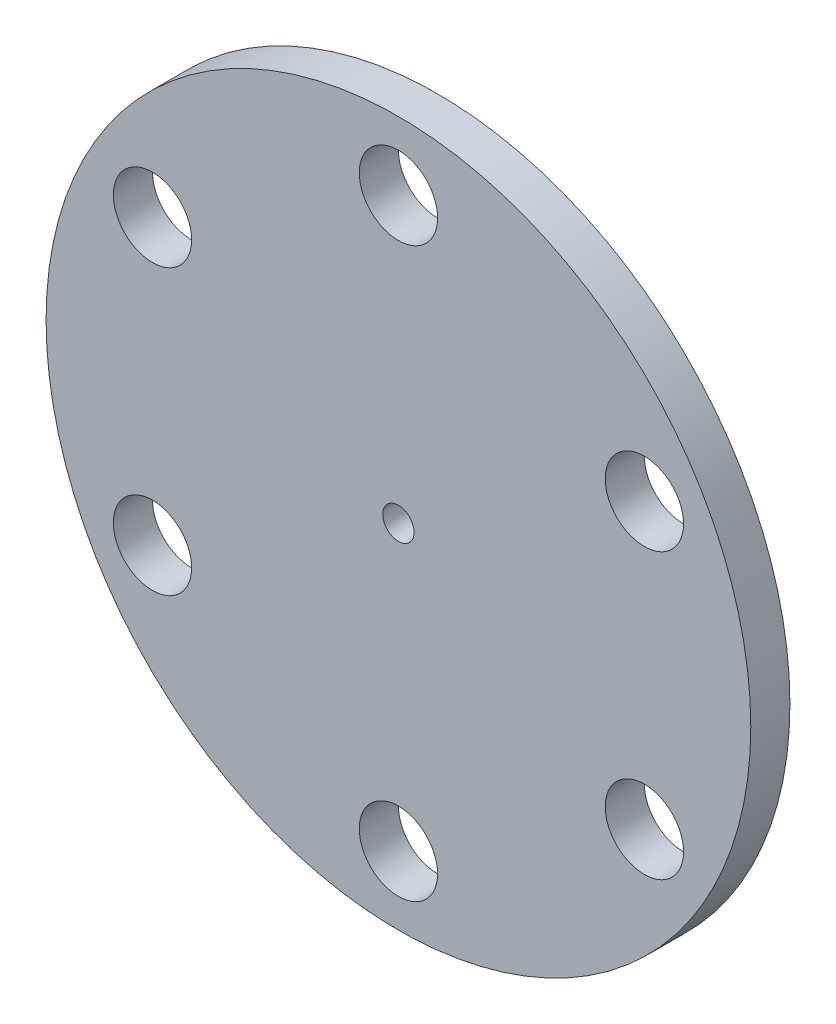
ISO-10303-21;
HEADER;
FILE_DESCRIPTION(('STEP AP214'),'2;1');
FILE_NAME('part.step','',(''),(''),'','','');
FILE_SCHEMA(('AUTOMOTIVE_DESIGN { 1 0 10303 214 1 1 1 1 }'));
ENDSEC;
DATA;
#1=APPLICATION_CONTEXT('core data for automotive mechanical design processes');
#2=APPLICATION_PROTOCOL_DEFINITION('international standard','automotive_design',2000,#1);
#3=PRODUCT_CONTEXT('',#1,'mechanical');
#4=PRODUCT('Part','Part','',(#3));
#5=PRODUCT_RELATED_PRODUCT_CATEGORY('part','',(#4));
#6=PRODUCT_DEFINITION_FORMATION('','',#4);
#7=PRODUCT_DEFINITION_CONTEXT('part definition',#1,'design');
#8=PRODUCT_DEFINITION('design','',#6,#7);
#9=PRODUCT_DEFINITION_SHAPE('','',#8);
#10=(LENGTH_UNIT() NAMED_UNIT(*) SI_UNIT(.MILLI.,.METRE.));
#11=(NAMED_UNIT(*) PLANE_ANGLE_UNIT() SI_UNIT($,.RADIAN.));
#12=(NAMED_UNIT(*) SI_UNIT($,.STERADIAN.) SOLID_ANGLE_UNIT());
#13=UNCERTAINTY_MEASURE_WITH_UNIT(LENGTH_MEASURE(1.E-05),#10,'distance_accuracy_value','');
#14=(GEOMETRIC_REPRESENTATION_CONTEXT(3) GLOBAL_UNCERTAINTY_ASSIGNED_CONTEXT((#13)) GLOBAL_UNIT_ASSIGNED_CONTEXT((#10,
#11,#12)) REPRESENTATION_CONTEXT('',''));
#15=CARTESIAN_POINT('',(0.,0.,0.));
#16=DIRECTION('',(0.,0.,1.));
#17=DIRECTION('',(1.,0.,0.));
#18=AXIS2_PLACEMENT_3D('',#15,#16,#17);
#19=CARTESIAN_POINT('',(0.,0.,5.));
#20=DIRECTION('',(0.,0.,1.));
#21=DIRECTION('',(1.,0.,0.));
#22=AXIS2_PLACEMENT_3D('',#19,#20,#21);
#23=PLANE('',#22);
#24=CARTESIAN_POINT('',(-31.4104291677928,-18.1348197353913,5.));
#25=DIRECTION('',(0.,0.,1.));
#26=DIRECTION('',(1.,0.,0.));
#27=AXIS2_PLACEMENT_3D('',#24,#25,#26);
#28=CIRCLE('',#27,5.);
#29=CARTESIAN_POINT('',(-26.4104291677928,-18.1348197353913,5.));
#30=VERTEX_POINT('',#29);
#31=EDGE_CURVE('E73',#30,#30,#28,.T.);
#32=ORIENTED_EDGE('',*,*,#31,.F.);
#33=EDGE_LOOP('',(#32));
#34=FACE_BOUND('',#33,.T.);
#35=CARTESIAN_POINT('',(31.4104291678006,-18.1348197353869,5.));
#36=DIRECTION('',(0.,0.,1.));
#37=DIRECTION('',(1.,0.,0.));
#38=AXIS2_PLACEMENT_3D('',#35,#36,#37);
#39=CIRCLE('',#38,5.);
#40=CARTESIAN_POINT('',(36.4104291678006,-18.1348197353869,5.));
#41=VERTEX_POINT('',#40);
#42=EDGE_CURVE('E61',#41,#41,#39,.T.);
#43=ORIENTED_EDGE('',*,*,#42,.F.);
#44=EDGE_LOOP('',(#43));
#45=FACE_BOUND('',#44,.T.);
#46=CARTESIAN_POINT('',(0.,0.,5.));
#47=DIRECTION('',(0.,0.,1.));
#48=DIRECTION('',(1.,0.,0.));
#49=AXIS2_PLACEMENT_3D('',#46,#47,#48);
#50=CIRCLE('',#49,2.);
#51=CARTESIAN_POINT('',(2.,0.,5.));
#52=VERTEX_POINT('',#51);
#53=EDGE_CURVE('E49',#52,#52,#50,.T.);
#54=ORIENTED_EDGE('',*,*,#53,.F.);
#55=EDGE_LOOP('',(#54));
#56=FACE_BOUND('',#55,.T.);
#57=CARTESIAN_POINT('',(0.,0.,5.));
#58=DIRECTION('',(0.,0.,1.));
#59=DIRECTION('',(1.,0.,0.));
#60=AXIS2_PLACEMENT_3D('',#57,#58,#59);
#61=CIRCLE('',#60,45.);
#62=CARTESIAN_POINT('',(45.,0.,5.));
#63=VERTEX_POINT('',#62);
#64=EDGE_CURVE('E10',#63,#63,#61,.T.);
#65=ORIENTED_EDGE('',*,*,#64,.T.);
#66=EDGE_LOOP('',(#65));
#67=FACE_BOUND('',#66,.T.);
#68=CARTESIAN_POINT('',(0.,36.2696394707782,5.));
#69=DIRECTION('',(0.,0.,1.));
#70=DIRECTION('',(1.,0.,0.));
#71=AXIS2_PLACEMENT_3D('',#68,#69,#70);
#72=CIRCLE('',#71,5.);
#73=CARTESIAN_POINT('',(5.,36.2696394707782,5.));
#74=VERTEX_POINT('',#73);
#75=EDGE_CURVE('E44',#74,#74,#72,.T.);
#76=ORIENTED_EDGE('',*,*,#75,.F.);
#77=EDGE_LOOP('',(#76));
#78=FACE_BOUND('',#77,.T.);
#79=CARTESIAN_POINT('',(31.410429167798,18.1348197353913,5.));
#80=DIRECTION('',(0.,0.,1.));
#81=DIRECTION('',(1.,0.,0.));
#82=AXIS2_PLACEMENT_3D('',#79,#80,#81);
#83=CIRCLE('',#82,5.);
#84=CARTESIAN_POINT('',(36.410429167798,18.1348197353913,5.));
#85=VERTEX_POINT('',#84);
#86=EDGE_CURVE('E55',#85,#85,#83,.T.);
#87=ORIENTED_EDGE('',*,*,#86,.F.);
#88=EDGE_LOOP('',(#87));
#89=FACE_BOUND('',#88,.T.);
#90=CARTESIAN_POINT('',(5.14534227134303E-12,-36.2696394707782,5.));
#91=DIRECTION('',(0.,0.,1.));
#92=DIRECTION('',(1.,0.,0.));
#93=AXIS2_PLACEMENT_3D('',#90,#91,#92);
#94=CIRCLE('',#93,5.);
#95=CARTESIAN_POINT('',(5.00000000000515,-36.2696394707782,5.));
#96=VERTEX_POINT('',#95);
#97=EDGE_CURVE('E67',#96,#96,#94,.T.);
#98=ORIENTED_EDGE('',*,*,#97,.F.);
#99=EDGE_LOOP('',(#98));
#100=FACE_BOUND('',#99,.T.);
#101=CARTESIAN_POINT('',(-31.4104291677954,18.1348197353868,5.));
#102=DIRECTION('',(0.,0.,1.));
#103=DIRECTION('',(1.,0.,0.));
#104=AXIS2_PLACEMENT_3D('',#101,#102,#103);
#105=CIRCLE('',#104,5.);
#106=CARTESIAN_POINT('',(-26.4104291677954,18.1348197353868,5.));
#107=VERTEX_POINT('',#106);
#108=EDGE_CURVE('E79',#107,#107,#105,.T.);
#109=ORIENTED_EDGE('',*,*,#108,.F.);
#110=EDGE_LOOP('',(#109));
#111=FACE_BOUND('',#110,.T.);
#112=ADVANCED_FACE('F33',(#34,#45,#56,#67,#78,#89,#100,#111),#23,.T.);
#113=CARTESIAN_POINT('',(0.,0.,0.));
#114=DIRECTION('',(0.,0.,1.));
#115=DIRECTION('',(1.,0.,0.));
#116=AXIS2_PLACEMENT_3D('',#113,#114,#115);
#117=PLANE('',#116);
#118=CARTESIAN_POINT('',(0.,0.,0.));
#119=DIRECTION('',(0.,0.,1.));
#120=DIRECTION('',(1.,0.,0.));
#121=AXIS2_PLACEMENT_3D('',#118,#119,#120);
#122=CIRCLE('',#121,45.);
#123=CARTESIAN_POINT('',(45.,0.,0.));
#124=VERTEX_POINT('',#123);
#125=EDGE_CURVE('E37',#124,#124,#122,.T.);
#126=ORIENTED_EDGE('',*,*,#125,.F.);
#127=EDGE_LOOP('',(#126));
#128=FACE_BOUND('',#127,.T.);
#129=CARTESIAN_POINT('',(0.,36.2696394707782,0.));
#130=DIRECTION('',(0.,0.,1.));
#131=DIRECTION('',(1.,0.,0.));
#132=AXIS2_PLACEMENT_3D('',#129,#130,#131);
#133=CIRCLE('',#132,5.);
#134=CARTESIAN_POINT('',(5.,36.2696394707782,0.));
#135=VERTEX_POINT('',#134);
#136=EDGE_CURVE('E46',#135,#135,#133,.T.);
#137=ORIENTED_EDGE('',*,*,#136,.T.);
#138=EDGE_LOOP('',(#137));
#139=FACE_BOUND('',#138,.T.);
#140=CARTESIAN_POINT('',(0.,0.,0.));
#141=DIRECTION('',(0.,0.,1.));
#142=DIRECTION('',(1.,0.,0.));
#143=AXIS2_PLACEMENT_3D('',#140,#141,#142);
#144=CIRCLE('',#143,2.);
#145=CARTESIAN_POINT('',(2.,0.,0.));
#146=VERTEX_POINT('',#145);
#147=EDGE_CURVE('E52',#146,#146,#144,.T.);
#148=ORIENTED_EDGE('',*,*,#147,.T.);
#149=EDGE_LOOP('',(#148));
#150=FACE_BOUND('',#149,.T.);
#151=CARTESIAN_POINT('',(31.410429167798,18.1348197353913,0.));
#152=DIRECTION('',(0.,0.,1.));
#153=DIRECTION('',(1.,0.,0.));
#154=AXIS2_PLACEMENT_3D('',#151,#152,#153);
#155=CIRCLE('',#154,5.);
#156=CARTESIAN_POINT('',(36.410429167798,18.1348197353913,0.));
#157=VERTEX_POINT('',#156);
#158=EDGE_CURVE('E58',#157,#157,#155,.T.);
#159=ORIENTED_EDGE('',*,*,#158,.T.);
#160=EDGE_LOOP('',(#159));
#161=FACE_BOUND('',#160,.T.);
#162=CARTESIAN_POINT('',(31.4104291678006,-18.1348197353869,0.));
#163=DIRECTION('',(0.,0.,1.));
#164=DIRECTION('',(1.,0.,0.));
#165=AXIS2_PLACEMENT_3D('',#162,#163,#164);
#166=CIRCLE('',#165,5.);
#167=CARTESIAN_POINT('',(36.4104291678006,-18.1348197353869,0.));
#168=VERTEX_POINT('',#167);
#169=EDGE_CURVE('E64',#168,#168,#166,.T.);
#170=ORIENTED_EDGE('',*,*,#169,.T.);
#171=EDGE_LOOP('',(#170));
#172=FACE_BOUND('',#171,.T.);
#173=CARTESIAN_POINT('',(5.14534227134303E-12,-36.2696394707782,0.));
#174=DIRECTION('',(0.,0.,1.));
#175=DIRECTION('',(1.,0.,0.));
#176=AXIS2_PLACEMENT_3D('',#173,#174,#175);
#177=CIRCLE('',#176,5.);
#178=CARTESIAN_POINT('',(5.00000000000515,-36.2696394707782,0.));
#179=VERTEX_POINT('',#178);
#180=EDGE_CURVE('E70',#179,#179,#177,.T.);
#181=ORIENTED_EDGE('',*,*,#180,.T.);
#182=EDGE_LOOP('',(#181));
#183=FACE_BOUND('',#182,.T.);
#184=CARTESIAN_POINT('',(-31.4104291677928,-18.1348197353913,0.));
#185=DIRECTION('',(0.,0.,1.));
#186=DIRECTION('',(1.,0.,0.));
#187=AXIS2_PLACEMENT_3D('',#184,#185,#186);
#188=CIRCLE('',#187,5.);
#189=CARTESIAN_POINT('',(-26.4104291677928,-18.1348197353913,0.));
#190=VERTEX_POINT('',#189);
#191=EDGE_CURVE('E76',#190,#190,#188,.T.);
#192=ORIENTED_EDGE('',*,*,#191,.T.);
#193=EDGE_LOOP('',(#192));
#194=FACE_BOUND('',#193,.T.);
#195=CARTESIAN_POINT('',(-31.4104291677954,18.1348197353868,0.));
#196=DIRECTION('',(0.,0.,1.));
#197=DIRECTION('',(1.,0.,0.));
#198=AXIS2_PLACEMENT_3D('',#195,#196,#197);
#199=CIRCLE('',#198,5.);
#200=CARTESIAN_POINT('',(-26.4104291677954,18.1348197353868,0.));
#201=VERTEX_POINT('',#200);
#202=EDGE_CURVE('E82',#201,#201,#199,.T.);
#203=ORIENTED_EDGE('',*,*,#202,.T.);
#204=EDGE_LOOP('',(#203));
#205=FACE_BOUND('',#204,.T.);
#206=ADVANCED_FACE('F92',(#128,#139,#150,#161,#172,#183,#194,#205),#117,.F.);
#207=CARTESIAN_POINT('',(0.,0.,5.));
#208=DIRECTION('',(0.,0.,-1.));
#209=DIRECTION('',(-1.,0.,0.));
#210=AXIS2_PLACEMENT_3D('',#207,#208,#209);
#211=CYLINDRICAL_SURFACE('',#210,45.);
#212=ORIENTED_EDGE('',*,*,#64,.F.);
#213=EDGE_LOOP('',(#212));
#214=FACE_BOUND('',#213,.T.);
#215=ORIENTED_EDGE('',*,*,#125,.T.);
#216=EDGE_LOOP('',(#215));
#217=FACE_BOUND('',#216,.T.);
#218=ADVANCED_FACE('F35',(#214,#217),#211,.T.);
#219=CARTESIAN_POINT('',(0.,36.2696394707782,5.));
#220=DIRECTION('',(0.,0.,-1.));
#221=DIRECTION('',(-1.,0.,0.));
#222=AXIS2_PLACEMENT_3D('',#219,#220,#221);
#223=CYLINDRICAL_SURFACE('',#222,5.);
#224=ORIENTED_EDGE('',*,*,#75,.T.);
#225=EDGE_LOOP('',(#224));
#226=FACE_BOUND('',#225,.T.);
#227=ORIENTED_EDGE('',*,*,#136,.F.);
#228=EDGE_LOOP('',(#227));
#229=FACE_BOUND('',#228,.T.);
#230=ADVANCED_FACE('F102',(#226,#229),#223,.F.);
#231=CARTESIAN_POINT('',(0.,0.,5.));
#232=DIRECTION('',(0.,0.,-1.));
#233=DIRECTION('',(-1.,0.,0.));
#234=AXIS2_PLACEMENT_3D('',#231,#232,#233);
#235=CYLINDRICAL_SURFACE('',#234,2.);
#236=ORIENTED_EDGE('',*,*,#53,.T.);
#237=EDGE_LOOP('',(#236));
#238=FACE_BOUND('',#237,.T.);
#239=ORIENTED_EDGE('',*,*,#147,.F.);
#240=EDGE_LOOP('',(#239));
#241=FACE_BOUND('',#240,.T.);
#242=ADVANCED_FACE('F105',(#238,#241),#235,.F.);
#243=CARTESIAN_POINT('',(31.410429167798,18.1348197353913,5.));
#244=DIRECTION('',(0.,0.,-1.));
#245=DIRECTION('',(-1.,0.,0.));
#246=AXIS2_PLACEMENT_3D('',#243,#244,#245);
#247=CYLINDRICAL_SURFACE('',#246,5.);
#248=ORIENTED_EDGE('',*,*,#86,.T.);
#249=EDGE_LOOP('',(#248));
#250=FACE_BOUND('',#249,.T.);
#251=ORIENTED_EDGE('',*,*,#158,.F.);
#252=EDGE_LOOP('',(#251));
#253=FACE_BOUND('',#252,.T.);
#254=ADVANCED_FACE('F109',(#250,#253),#247,.F.);
#255=CARTESIAN_POINT('',(31.4104291678006,-18.1348197353869,5.));
#256=DIRECTION('',(0.,0.,-1.));
#257=DIRECTION('',(-1.,0.,0.));
#258=AXIS2_PLACEMENT_3D('',#255,#256,#257);
#259=CYLINDRICAL_SURFACE('',#258,5.);
#260=ORIENTED_EDGE('',*,*,#42,.T.);
#261=EDGE_LOOP('',(#260));
#262=FACE_BOUND('',#261,.T.);
#263=ORIENTED_EDGE('',*,*,#169,.F.);
#264=EDGE_LOOP('',(#263));
#265=FACE_BOUND('',#264,.T.);
#266=ADVANCED_FACE('F113',(#262,#265),#259,.F.);
#267=CARTESIAN_POINT('',(5.14534227134303E-12,-36.2696394707782,5.));
#268=DIRECTION('',(0.,0.,-1.));
#269=DIRECTION('',(-1.,0.,0.));
#270=AXIS2_PLACEMENT_3D('',#267,#268,#269);
#271=CYLINDRICAL_SURFACE('',#270,5.);
#272=ORIENTED_EDGE('',*,*,#97,.T.);
#273=EDGE_LOOP('',(#272));
#274=FACE_BOUND('',#273,.T.);
#275=ORIENTED_EDGE('',*,*,#180,.F.);
#276=EDGE_LOOP('',(#275));
#277=FACE_BOUND('',#276,.T.);
#278=ADVANCED_FACE('F117',(#274,#277),#271,.F.);
#279=CARTESIAN_POINT('',(-31.4104291677928,-18.1348197353913,5.));
#280=DIRECTION('',(0.,0.,-1.));
#281=DIRECTION('',(-1.,0.,0.));
#282=AXIS2_PLACEMENT_3D('',#279,#280,#281);
#283=CYLINDRICAL_SURFACE('',#282,5.);
#284=ORIENTED_EDGE('',*,*,#31,.T.);
#285=EDGE_LOOP('',(#284));
#286=FACE_BOUND('',#285,.T.);
#287=ORIENTED_EDGE('',*,*,#191,.F.);
#288=EDGE_LOOP('',(#287));
#289=FACE_BOUND('',#288,.T.);
#290=ADVANCED_FACE('F121',(#286,#289),#283,.F.);
#291=CARTESIAN_POINT('',(-31.4104291677954,18.1348197353868,5.));
#292=DIRECTION('',(0.,0.,-1.));
#293=DIRECTION('',(-1.,0.,0.));
#294=AXIS2_PLACEMENT_3D('',#291,#292,#293);
#295=CYLINDRICAL_SURFACE('',#294,5.);
#296=ORIENTED_EDGE('',*,*,#108,.T.);
#297=EDGE_LOOP('',(#296));
#298=FACE_BOUND('',#297,.T.);
#299=ORIENTED_EDGE('',*,*,#202,.F.);
#300=EDGE_LOOP('',(#299));
#301=FACE_BOUND('',#300,.T.);
#302=ADVANCED_FACE('F88',(#298,#301),#295,.F.);
#303=CLOSED_SHELL('',(#112,#206,#218,#230,#242,#254,#266,#278,#290,#302));
#304=MANIFOLD_SOLID_BREP('B2',#303);
#305=ADVANCED_BREP_SHAPE_REPRESENTATION('',(#18,#304),#14);
#306=SHAPE_DEFINITION_REPRESENTATION(#9,#305);
ENDSEC;
END-ISO-10303-21;
